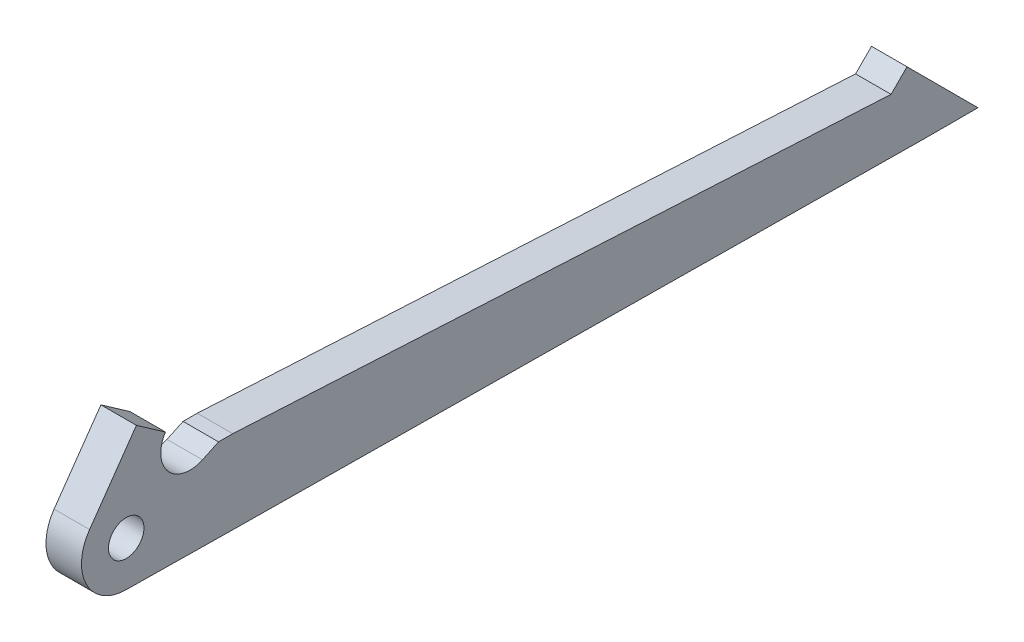
ISO-10303-21;
HEADER;
FILE_DESCRIPTION(('STEP AP214'),'2;1');
FILE_NAME('part.step','',(''),(''),'','','');
FILE_SCHEMA(('AUTOMOTIVE_DESIGN { 1 0 10303 214 1 1 1 1 }'));
ENDSEC;
DATA;
#1=APPLICATION_CONTEXT('core data for automotive mechanical design processes');
#2=APPLICATION_PROTOCOL_DEFINITION('international standard','automotive_design',2000,#1);
#3=PRODUCT_CONTEXT('',#1,'mechanical');
#4=PRODUCT('Part','Part','',(#3));
#5=PRODUCT_RELATED_PRODUCT_CATEGORY('part','',(#4));
#6=PRODUCT_DEFINITION_FORMATION('','',#4);
#7=PRODUCT_DEFINITION_CONTEXT('part definition',#1,'design');
#8=PRODUCT_DEFINITION('design','',#6,#7);
#9=PRODUCT_DEFINITION_SHAPE('','',#8);
#10=(LENGTH_UNIT() NAMED_UNIT(*) SI_UNIT(.MILLI.,.METRE.));
#11=(NAMED_UNIT(*) PLANE_ANGLE_UNIT() SI_UNIT($,.RADIAN.));
#12=(NAMED_UNIT(*) SI_UNIT($,.STERADIAN.) SOLID_ANGLE_UNIT());
#13=UNCERTAINTY_MEASURE_WITH_UNIT(LENGTH_MEASURE(1.E-05),#10,'distance_accuracy_value','');
#14=(GEOMETRIC_REPRESENTATION_CONTEXT(3) GLOBAL_UNCERTAINTY_ASSIGNED_CONTEXT((#13)) GLOBAL_UNIT_ASSIGNED_CONTEXT((#10,
#11,#12)) REPRESENTATION_CONTEXT('',''));
#15=CARTESIAN_POINT('',(0.,0.,0.));
#16=DIRECTION('',(0.,0.,1.));
#17=DIRECTION('',(1.,0.,0.));
#18=AXIS2_PLACEMENT_3D('',#15,#16,#17);
#19=CARTESIAN_POINT('',(6.35,9.525,-176.47164647412));
#20=DIRECTION('',(1.,0.,0.));
#21=DIRECTION('',(0.,0.,-1.));
#22=AXIS2_PLACEMENT_3D('',#19,#20,#21);
#23=PLANE('',#22);
#24=CARTESIAN_POINT('',(6.35,9.525,-176.47164647412));
#25=DIRECTION('',(1.,0.,0.));
#26=DIRECTION('',(0.,0.,-1.));
#27=AXIS2_PLACEMENT_3D('',#24,#25,#26);
#28=CIRCLE('',#27,8.00100000000001);
#29=CARTESIAN_POINT('',(6.35,14.1141850672447,-169.917610967764));
#30=VERTEX_POINT('',#29);
#31=CARTESIAN_POINT('',(6.35,1.52470715135464,-176.365272906379));
#32=VERTEX_POINT('',#31);
#33=EDGE_CURVE('E198',#30,#32,#28,.T.);
#34=ORIENTED_EDGE('',*,*,#33,.T.);
#35=DIRECTION('',(0.,-0.0132950340883751,-0.999911617128528));
#36=VECTOR('',#35,1.);
#37=CARTESIAN_POINT('',(6.35,1.27000000001228,-195.521646474134));
#38=LINE('',#37,#36);
#39=CARTESIAN_POINT('',(6.35,1.27000000001228,-195.521646474134));
#40=VERTEX_POINT('',#39);
#41=EDGE_CURVE('E200',#32,#40,#38,.T.);
#42=ORIENTED_EDGE('',*,*,#41,.T.);
#43=DIRECTION('',(0.,-0.0102558708428085,-0.999947407173625));
#44=VECTOR('',#43,1.);
#45=CARTESIAN_POINT('',(6.35,1.27000000001228,-195.521646474134));
#46=LINE('',#45,#44);
#47=CARTESIAN_POINT('',(6.35,1.22755538373154E-11,-319.346646474108));
#48=VERTEX_POINT('',#47);
#49=EDGE_CURVE('E187',#40,#48,#46,.T.);
#50=ORIENTED_EDGE('',*,*,#49,.T.);
#51=DIRECTION('',(0.,0.,-1.));
#52=VECTOR('',#51,1.);
#53=CARTESIAN_POINT('',(6.35,1.22755538373154E-11,-319.346646474108));
#54=LINE('',#53,#52);
#55=CARTESIAN_POINT('',(6.35,1.22755538373154E-11,-328.87164647412));
#56=VERTEX_POINT('',#55);
#57=EDGE_CURVE('E138',#48,#56,#54,.T.);
#58=ORIENTED_EDGE('',*,*,#57,.T.);
#59=DIRECTION('',(0.,0.70710678118655,0.707106781186545));
#60=VECTOR('',#59,1.);
#61=CARTESIAN_POINT('',(6.35,9.52500000002455,-319.346646474108));
#62=LINE('',#61,#60);
#63=CARTESIAN_POINT('',(6.35,12.7000000000245,-316.171646474108));
#64=VERTEX_POINT('',#63);
#65=EDGE_CURVE('E130',#56,#64,#62,.T.);
#66=ORIENTED_EDGE('',*,*,#65,.T.);
#67=DIRECTION('',(0.,-0.707106781186549,0.707106781186546));
#68=VECTOR('',#67,1.);
#69=CARTESIAN_POINT('',(6.35,12.7000000000245,-316.171646474108));
#70=LINE('',#69,#68);
#71=CARTESIAN_POINT('',(6.35,9.84818365484253,-313.319830128926));
#72=VERTEX_POINT('',#71);
#73=EDGE_CURVE('E134',#64,#72,#70,.T.);
#74=ORIENTED_EDGE('',*,*,#73,.T.);
#75=DIRECTION('',(0.,0.0535473405230793,0.998565311996619));
#76=VECTOR('',#75,1.);
#77=CARTESIAN_POINT('',(6.35,16.1650258056597,-195.52164647412));
#78=LINE('',#77,#76);
#79=CARTESIAN_POINT('',(6.35,16.1650258056597,-195.52164647412));
#80=VERTEX_POINT('',#79);
#81=EDGE_CURVE('E141',#72,#80,#78,.T.);
#82=ORIENTED_EDGE('',*,*,#81,.T.);
#83=DIRECTION('',(0.,0.,1.));
#84=VECTOR('',#83,1.);
#85=CARTESIAN_POINT('',(6.35,16.1650258056595,-192.993410989748));
#86=LINE('',#85,#84);
#87=CARTESIAN_POINT('',(6.35,16.1650258056595,-192.993410989748));
#88=VERTEX_POINT('',#87);
#89=EDGE_CURVE('E202',#80,#88,#86,.T.);
#90=ORIENTED_EDGE('',*,*,#89,.T.);
#91=DIRECTION('',(0.,-0.422618261740695,0.906307787036652));
#92=VECTOR('',#91,1.);
#93=CARTESIAN_POINT('',(6.35,14.8232128246327,-190.115883765906));
#94=LINE('',#93,#92);
#95=CARTESIAN_POINT('',(6.35,14.8232128246328,-190.115883765906));
#96=VERTEX_POINT('',#95);
#97=EDGE_CURVE('E204',#88,#96,#94,.T.);
#98=ORIENTED_EDGE('',*,*,#97,.T.);
#99=CARTESIAN_POINT('',(6.35,19.5790932010246,-187.898180325126));
#100=DIRECTION('',(-1.,0.,0.));
#101=DIRECTION('',(0.,0.,-1.));
#102=AXIS2_PLACEMENT_3D('',#99,#100,#101);
#103=CIRCLE('',#102,5.24753339253761);
#104=CARTESIAN_POINT('',(6.35,22.4356903032563,-183.496310301906));
#105=VERTEX_POINT('',#104);
#106=EDGE_CURVE('E206',#96,#105,#103,.T.);
#107=ORIENTED_EDGE('',*,*,#106,.T.);
#108=DIRECTION('',(0.,0.573576436351047,0.819152044288991));
#109=VECTOR('',#108,1.);
#110=CARTESIAN_POINT('',(6.35,26.0779006740854,-178.294694820671));
#111=LINE('',#110,#109);
#112=CARTESIAN_POINT('',(6.35,26.0779006740854,-178.294694820671));
#113=VERTEX_POINT('',#112);
#114=EDGE_CURVE('E208',#105,#113,#111,.T.);
#115=ORIENTED_EDGE('',*,*,#114,.T.);
#116=DIRECTION('',(0.,-0.819152044288991,0.573576436351048));
#117=VECTOR('',#116,1.);
#118=CARTESIAN_POINT('',(6.35,14.1141850672447,-169.917610967764));
#119=LINE('',#118,#117);
#120=EDGE_CURVE('E63',#113,#30,#119,.T.);
#121=ORIENTED_EDGE('',*,*,#120,.T.);
#122=EDGE_LOOP('',(#34,#42,#50,#58,#66,#74,#82,#90,#98,#107,#115,#121));
#123=FACE_BOUND('',#122,.T.);
#124=CARTESIAN_POINT('',(6.35,9.525,-176.47164647412));
#125=DIRECTION('',(1.,0.,0.));
#126=DIRECTION('',(0.,0.,-1.));
#127=AXIS2_PLACEMENT_3D('',#124,#125,#126);
#128=CIRCLE('',#127,3.17499999999995);
#129=CARTESIAN_POINT('',(6.35,9.525,-179.64664647412));
#130=VERTEX_POINT('',#129);
#131=EDGE_CURVE('E194',#130,#130,#128,.T.);
#132=ORIENTED_EDGE('',*,*,#131,.F.);
#133=EDGE_LOOP('',(#132));
#134=FACE_BOUND('',#133,.T.);
#135=ADVANCED_FACE('F41',(#123,#134),#23,.T.);
#136=CARTESIAN_POINT('',(6.35,9.525,-176.47164647412));
#137=DIRECTION('',(-1.,0.,0.));
#138=DIRECTION('',(0.,0.,1.));
#139=AXIS2_PLACEMENT_3D('',#136,#137,#138);
#140=CYLINDRICAL_SURFACE('',#139,8.00100000000001);
#141=DIRECTION('',(-1.,0.,0.));
#142=VECTOR('',#141,1.);
#143=CARTESIAN_POINT('',(6.35,14.1141850672447,-169.917610967764));
#144=LINE('',#143,#142);
#145=CARTESIAN_POINT('',(0.,14.1141850672447,-169.917610967764));
#146=VERTEX_POINT('',#145);
#147=EDGE_CURVE('E211',#30,#146,#144,.T.);
#148=ORIENTED_EDGE('',*,*,#147,.T.);
#149=CARTESIAN_POINT('',(0.,9.525,-176.47164647412));
#150=DIRECTION('',(1.,0.,0.));
#151=DIRECTION('',(0.,0.,-1.));
#152=AXIS2_PLACEMENT_3D('',#149,#150,#151);
#153=CIRCLE('',#152,8.00100000000001);
#154=CARTESIAN_POINT('',(0.,1.52470715135464,-176.365272906379));
#155=VERTEX_POINT('',#154);
#156=EDGE_CURVE('E169',#146,#155,#153,.T.);
#157=ORIENTED_EDGE('',*,*,#156,.T.);
#158=DIRECTION('',(-1.,0.,0.));
#159=VECTOR('',#158,1.);
#160=CARTESIAN_POINT('',(6.35,1.52470715135464,-176.365272906379));
#161=LINE('',#160,#159);
#162=EDGE_CURVE('E49',#32,#155,#161,.T.);
#163=ORIENTED_EDGE('',*,*,#162,.F.);
#164=ORIENTED_EDGE('',*,*,#33,.F.);
#165=EDGE_LOOP('',(#148,#157,#163,#164));
#166=FACE_BOUND('',#165,.T.);
#167=ADVANCED_FACE('F43',(#166),#140,.T.);
#168=CARTESIAN_POINT('',(6.35,1.27000000001228,-195.521646474134));
#169=DIRECTION('',(0.,0.999911617128528,-0.0132950340883751));
#170=DIRECTION('',(0.,0.0132950340883751,0.999911617128528));
#171=AXIS2_PLACEMENT_3D('',#168,#169,#170);
#172=PLANE('',#171);
#173=ORIENTED_EDGE('',*,*,#162,.T.);
#174=DIRECTION('',(0.,-0.0132950340883751,-0.999911617128528));
#175=VECTOR('',#174,1.);
#176=CARTESIAN_POINT('',(0.,1.27000000001228,-195.521646474134));
#177=LINE('',#176,#175);
#178=CARTESIAN_POINT('',(0.,1.27000000001228,-195.521646474134));
#179=VERTEX_POINT('',#178);
#180=EDGE_CURVE('E166',#155,#179,#177,.T.);
#181=ORIENTED_EDGE('',*,*,#180,.T.);
#182=DIRECTION('',(-1.,0.,0.));
#183=VECTOR('',#182,1.);
#184=CARTESIAN_POINT('',(6.35,1.27000000001228,-195.521646474134));
#185=LINE('',#184,#183);
#186=EDGE_CURVE('E229',#40,#179,#185,.T.);
#187=ORIENTED_EDGE('',*,*,#186,.F.);
#188=ORIENTED_EDGE('',*,*,#41,.F.);
#189=EDGE_LOOP('',(#173,#181,#187,#188));
#190=FACE_BOUND('',#189,.T.);
#191=ADVANCED_FACE('F234',(#190),#172,.F.);
#192=CARTESIAN_POINT('',(6.35,16.1650258056595,-192.993410989748));
#193=DIRECTION('',(0.,-1.,0.));
#194=DIRECTION('',(0.,0.,-1.));
#195=AXIS2_PLACEMENT_3D('',#192,#193,#194);
#196=PLANE('',#195);
#197=DIRECTION('',(-1.,0.,0.));
#198=VECTOR('',#197,1.);
#199=CARTESIAN_POINT('',(6.35,16.1650258056597,-195.52164647412));
#200=LINE('',#199,#198);
#201=CARTESIAN_POINT('',(0.,16.1650258056597,-195.52164647412));
#202=VERTEX_POINT('',#201);
#203=EDGE_CURVE('E226',#80,#202,#200,.T.);
#204=ORIENTED_EDGE('',*,*,#203,.T.);
#205=DIRECTION('',(0.,0.,1.));
#206=VECTOR('',#205,1.);
#207=CARTESIAN_POINT('',(0.,16.1650258056595,-192.993410989748));
#208=LINE('',#207,#206);
#209=CARTESIAN_POINT('',(0.,16.1650258056595,-192.993410989748));
#210=VERTEX_POINT('',#209);
#211=EDGE_CURVE('E163',#202,#210,#208,.T.);
#212=ORIENTED_EDGE('',*,*,#211,.T.);
#213=DIRECTION('',(-1.,0.,0.));
#214=VECTOR('',#213,1.);
#215=CARTESIAN_POINT('',(6.35,16.1650258056595,-192.993410989748));
#216=LINE('',#215,#214);
#217=EDGE_CURVE('E223',#88,#210,#216,.T.);
#218=ORIENTED_EDGE('',*,*,#217,.F.);
#219=ORIENTED_EDGE('',*,*,#89,.F.);
#220=EDGE_LOOP('',(#204,#212,#218,#219));
#221=FACE_BOUND('',#220,.T.);
#222=ADVANCED_FACE('F256',(#221),#196,.F.);
#223=CARTESIAN_POINT('',(6.35,14.8232128246327,-190.115883765906));
#224=DIRECTION('',(0.,-0.906307787036652,-0.422618261740695));
#225=DIRECTION('',(0.,0.422618261740695,-0.906307787036652));
#226=AXIS2_PLACEMENT_3D('',#223,#224,#225);
#227=PLANE('',#226);
#228=ORIENTED_EDGE('',*,*,#217,.T.);
#229=DIRECTION('',(0.,-0.422618261740695,0.906307787036652));
#230=VECTOR('',#229,1.);
#231=CARTESIAN_POINT('',(0.,14.8232128246327,-190.115883765906));
#232=LINE('',#231,#230);
#233=CARTESIAN_POINT('',(0.,14.8232128246328,-190.115883765906));
#234=VERTEX_POINT('',#233);
#235=EDGE_CURVE('E181',#210,#234,#232,.T.);
#236=ORIENTED_EDGE('',*,*,#235,.T.);
#237=DIRECTION('',(-1.,0.,0.));
#238=VECTOR('',#237,1.);
#239=CARTESIAN_POINT('',(6.35,14.8232128246328,-190.115883765906));
#240=LINE('',#239,#238);
#241=EDGE_CURVE('E220',#96,#234,#240,.T.);
#242=ORIENTED_EDGE('',*,*,#241,.F.);
#243=ORIENTED_EDGE('',*,*,#97,.F.);
#244=EDGE_LOOP('',(#228,#236,#242,#243));
#245=FACE_BOUND('',#244,.T.);
#246=ADVANCED_FACE('F252',(#245),#227,.F.);
#247=CARTESIAN_POINT('',(6.35,19.5790932010246,-187.898180325126));
#248=DIRECTION('',(-1.,0.,0.));
#249=DIRECTION('',(0.,0.,1.));
#250=AXIS2_PLACEMENT_3D('',#247,#248,#249);
#251=CYLINDRICAL_SURFACE('',#250,5.24753339253761);
#252=ORIENTED_EDGE('',*,*,#241,.T.);
#253=CARTESIAN_POINT('',(0.,19.5790932010246,-187.898180325126));
#254=DIRECTION('',(1.,0.,0.));
#255=DIRECTION('',(0.,0.,-1.));
#256=AXIS2_PLACEMENT_3D('',#253,#254,#255);
#257=CIRCLE('',#256,5.24753339253761);
#258=CARTESIAN_POINT('',(0.,22.4356903032563,-183.496310301906));
#259=VERTEX_POINT('',#258);
#260=EDGE_CURVE('E178',#234,#259,#257,.F.);
#261=ORIENTED_EDGE('',*,*,#260,.T.);
#262=DIRECTION('',(-1.,0.,0.));
#263=VECTOR('',#262,1.);
#264=CARTESIAN_POINT('',(6.35,22.4356903032563,-183.496310301906));
#265=LINE('',#264,#263);
#266=EDGE_CURVE('E217',#105,#259,#265,.T.);
#267=ORIENTED_EDGE('',*,*,#266,.F.);
#268=ORIENTED_EDGE('',*,*,#106,.F.);
#269=EDGE_LOOP('',(#252,#261,#267,#268));
#270=FACE_BOUND('',#269,.T.);
#271=ADVANCED_FACE('F247',(#270),#251,.F.);
#272=CARTESIAN_POINT('',(6.35,26.0779006740854,-178.294694820671));
#273=DIRECTION('',(0.,-0.819152044288991,0.573576436351047));
#274=DIRECTION('',(0.,-0.573576436351047,-0.819152044288991));
#275=AXIS2_PLACEMENT_3D('',#272,#273,#274);
#276=PLANE('',#275);
#277=ORIENTED_EDGE('',*,*,#266,.T.);
#278=DIRECTION('',(0.,0.573576436351047,0.819152044288991));
#279=VECTOR('',#278,1.);
#280=CARTESIAN_POINT('',(0.,26.0779006740854,-178.294694820671));
#281=LINE('',#280,#279);
#282=CARTESIAN_POINT('',(0.,26.0779006740854,-178.294694820671));
#283=VERTEX_POINT('',#282);
#284=EDGE_CURVE('E175',#259,#283,#281,.T.);
#285=ORIENTED_EDGE('',*,*,#284,.T.);
#286=DIRECTION('',(-1.,0.,0.));
#287=VECTOR('',#286,1.);
#288=CARTESIAN_POINT('',(6.35,26.0779006740854,-178.294694820671));
#289=LINE('',#288,#287);
#290=EDGE_CURVE('E214',#113,#283,#289,.T.);
#291=ORIENTED_EDGE('',*,*,#290,.F.);
#292=ORIENTED_EDGE('',*,*,#114,.F.);
#293=EDGE_LOOP('',(#277,#285,#291,#292));
#294=FACE_BOUND('',#293,.T.);
#295=ADVANCED_FACE('F244',(#294),#276,.F.);
#296=CARTESIAN_POINT('',(6.35,14.1141850672447,-169.917610967764));
#297=DIRECTION('',(0.,-0.573576436351048,-0.819152044288991));
#298=DIRECTION('',(0.,0.819152044288991,-0.573576436351048));
#299=AXIS2_PLACEMENT_3D('',#296,#297,#298);
#300=PLANE('',#299);
#301=ORIENTED_EDGE('',*,*,#290,.T.);
#302=DIRECTION('',(0.,-0.819152044288991,0.573576436351048));
#303=VECTOR('',#302,1.);
#304=CARTESIAN_POINT('',(0.,14.1141850672447,-169.917610967764));
#305=LINE('',#304,#303);
#306=EDGE_CURVE('E172',#283,#146,#305,.T.);
#307=ORIENTED_EDGE('',*,*,#306,.T.);
#308=ORIENTED_EDGE('',*,*,#147,.F.);
#309=ORIENTED_EDGE('',*,*,#120,.F.);
#310=EDGE_LOOP('',(#301,#307,#308,#309));
#311=FACE_BOUND('',#310,.T.);
#312=ADVANCED_FACE('F240',(#311),#300,.F.);
#313=CARTESIAN_POINT('',(6.35,9.525,-176.47164647412));
#314=DIRECTION('',(-1.,0.,0.));
#315=DIRECTION('',(0.,0.,1.));
#316=AXIS2_PLACEMENT_3D('',#313,#314,#315);
#317=CYLINDRICAL_SURFACE('',#316,3.17499999999995);
#318=CARTESIAN_POINT('',(0.,9.525,-176.47164647412));
#319=DIRECTION('',(1.,0.,0.));
#320=DIRECTION('',(0.,0.,-1.));
#321=AXIS2_PLACEMENT_3D('',#318,#319,#320);
#322=CIRCLE('',#321,3.17499999999995);
#323=CARTESIAN_POINT('',(0.,9.525,-179.64664647412));
#324=VERTEX_POINT('',#323);
#325=EDGE_CURVE('E184',#324,#324,#322,.T.);
#326=ORIENTED_EDGE('',*,*,#325,.F.);
#327=EDGE_LOOP('',(#326));
#328=FACE_BOUND('',#327,.T.);
#329=ORIENTED_EDGE('',*,*,#131,.T.);
#330=EDGE_LOOP('',(#329));
#331=FACE_BOUND('',#330,.T.);
#332=ADVANCED_FACE('F283',(#328,#331),#317,.F.);
#333=CARTESIAN_POINT('',(-140.676209502454,16.1650258056597,-195.52164647412));
#334=DIRECTION('',(0.,0.998565311996619,-0.0535473405230793));
#335=DIRECTION('',(0.,0.0535473405230793,0.998565311996619));
#336=AXIS2_PLACEMENT_3D('',#333,#334,#335);
#337=PLANE('',#336);
#338=DIRECTION('',(1.,0.,0.));
#339=VECTOR('',#338,1.);
#340=CARTESIAN_POINT('',(-6.81198504538538,9.84818365484253,-313.319830128926));
#341=LINE('',#340,#339);
#342=CARTESIAN_POINT('',(0.,9.84818365484256,-313.319830128926));
#343=VERTEX_POINT('',#342);
#344=EDGE_CURVE('E149',#343,#72,#341,.T.);
#345=ORIENTED_EDGE('',*,*,#344,.F.);
#346=DIRECTION('',(0.,-0.0535473405230793,-0.998565311996619));
#347=VECTOR('',#346,1.);
#348=CARTESIAN_POINT('',(0.,16.1650258056597,-195.52164647412));
#349=LINE('',#348,#347);
#350=EDGE_CURVE('E160',#202,#343,#349,.T.);
#351=ORIENTED_EDGE('',*,*,#350,.F.);
#352=ORIENTED_EDGE('',*,*,#203,.F.);
#353=ORIENTED_EDGE('',*,*,#81,.F.);
#354=EDGE_LOOP('',(#345,#351,#352,#353));
#355=FACE_BOUND('',#354,.T.);
#356=ADVANCED_FACE('F260',(#355),#337,.T.);
#357=CARTESIAN_POINT('',(-140.676209502454,9.52500000002455,-319.346646474108));
#358=DIRECTION('',(0.,0.707106781186546,-0.70710678118655));
#359=DIRECTION('',(0.,0.70710678118655,0.707106781186546));
#360=AXIS2_PLACEMENT_3D('',#357,#358,#359);
#361=PLANE('',#360);
#362=DIRECTION('',(0.,-0.70710678118655,-0.707106781186546));
#363=VECTOR('',#362,1.);
#364=CARTESIAN_POINT('',(0.,9.52500000002455,-319.346646474108));
#365=LINE('',#364,#363);
#366=CARTESIAN_POINT('',(0.,12.7000000000245,-316.171646474108));
#367=VERTEX_POINT('',#366);
#368=CARTESIAN_POINT('',(0.,1.22749033160119E-11,-328.87164647412));
#369=VERTEX_POINT('',#368);
#370=EDGE_CURVE('E146',#367,#369,#365,.T.);
#371=ORIENTED_EDGE('',*,*,#370,.F.);
#372=DIRECTION('',(1.,0.,0.));
#373=VECTOR('',#372,1.);
#374=CARTESIAN_POINT('',(-6.81198504538538,12.7000000000245,-316.171646474108));
#375=LINE('',#374,#373);
#376=EDGE_CURVE('E144',#367,#64,#375,.T.);
#377=ORIENTED_EDGE('',*,*,#376,.T.);
#378=ORIENTED_EDGE('',*,*,#65,.F.);
#379=DIRECTION('',(1.,0.,0.));
#380=VECTOR('',#379,1.);
#381=CARTESIAN_POINT('',(-140.676209502454,1.22755538373154E-11,-328.87164647412));
#382=LINE('',#381,#380);
#383=EDGE_CURVE('E192',#369,#56,#382,.T.);
#384=ORIENTED_EDGE('',*,*,#383,.F.);
#385=EDGE_LOOP('',(#371,#377,#378,#384));
#386=FACE_BOUND('',#385,.T.);
#387=ADVANCED_FACE('F145',(#386),#361,.T.);
#388=CARTESIAN_POINT('',(-140.676209502454,1.22755538373154E-11,-319.346646474108));
#389=DIRECTION('',(0.,-1.,0.));
#390=DIRECTION('',(0.,0.,-1.));
#391=AXIS2_PLACEMENT_3D('',#388,#389,#390);
#392=PLANE('',#391);
#393=DIRECTION('',(0.,0.,1.));
#394=VECTOR('',#393,1.);
#395=CARTESIAN_POINT('',(0.,1.22755538373154E-11,-319.346646474108));
#396=LINE('',#395,#394);
#397=CARTESIAN_POINT('',(0.,1.22755538373154E-11,-319.346646474108));
#398=VERTEX_POINT('',#397);
#399=EDGE_CURVE('E55',#369,#398,#396,.T.);
#400=ORIENTED_EDGE('',*,*,#399,.F.);
#401=ORIENTED_EDGE('',*,*,#383,.T.);
#402=ORIENTED_EDGE('',*,*,#57,.F.);
#403=DIRECTION('',(1.,0.,0.));
#404=VECTOR('',#403,1.);
#405=CARTESIAN_POINT('',(-140.676209502454,1.22755538373154E-11,-319.346646474108));
#406=LINE('',#405,#404);
#407=EDGE_CURVE('E191',#398,#48,#406,.T.);
#408=ORIENTED_EDGE('',*,*,#407,.F.);
#409=EDGE_LOOP('',(#400,#401,#402,#408));
#410=FACE_BOUND('',#409,.T.);
#411=ADVANCED_FACE('F263',(#410),#392,.T.);
#412=CARTESIAN_POINT('',(-140.676209502454,1.27000000001228,-195.521646474134));
#413=DIRECTION('',(0.,-0.999947407173625,0.0102558708428085));
#414=DIRECTION('',(0.,-0.0102558708428085,-0.999947407173625));
#415=AXIS2_PLACEMENT_3D('',#412,#413,#414);
#416=PLANE('',#415);
#417=DIRECTION('',(0.,0.0102558708428085,0.999947407173625));
#418=VECTOR('',#417,1.);
#419=CARTESIAN_POINT('',(0.,1.27000000001228,-195.521646474134));
#420=LINE('',#419,#418);
#421=EDGE_CURVE('E12',#398,#179,#420,.T.);
#422=ORIENTED_EDGE('',*,*,#421,.F.);
#423=ORIENTED_EDGE('',*,*,#407,.T.);
#424=ORIENTED_EDGE('',*,*,#49,.F.);
#425=ORIENTED_EDGE('',*,*,#186,.T.);
#426=EDGE_LOOP('',(#422,#423,#424,#425));
#427=FACE_BOUND('',#426,.T.);
#428=ADVANCED_FACE('F266',(#427),#416,.T.);
#429=CARTESIAN_POINT('',(0.,9.525,-176.47164647412));
#430=DIRECTION('',(1.,0.,0.));
#431=DIRECTION('',(0.,0.,-1.));
#432=AXIS2_PLACEMENT_3D('',#429,#430,#431);
#433=PLANE('',#432);
#434=ORIENTED_EDGE('',*,*,#325,.T.);
#435=EDGE_LOOP('',(#434));
#436=FACE_BOUND('',#435,.T.);
#437=ORIENTED_EDGE('',*,*,#211,.F.);
#438=ORIENTED_EDGE('',*,*,#350,.T.);
#439=DIRECTION('',(0.,0.707106781186549,-0.707106781186546));
#440=VECTOR('',#439,1.);
#441=CARTESIAN_POINT('',(0.,12.7000000000245,-316.171646474108));
#442=LINE('',#441,#440);
#443=EDGE_CURVE('E156',#343,#367,#442,.T.);
#444=ORIENTED_EDGE('',*,*,#443,.T.);
#445=ORIENTED_EDGE('',*,*,#370,.T.);
#446=ORIENTED_EDGE('',*,*,#399,.T.);
#447=ORIENTED_EDGE('',*,*,#421,.T.);
#448=ORIENTED_EDGE('',*,*,#180,.F.);
#449=ORIENTED_EDGE('',*,*,#156,.F.);
#450=ORIENTED_EDGE('',*,*,#306,.F.);
#451=ORIENTED_EDGE('',*,*,#284,.F.);
#452=ORIENTED_EDGE('',*,*,#260,.F.);
#453=ORIENTED_EDGE('',*,*,#235,.F.);
#454=EDGE_LOOP('',(#437,#438,#444,#445,#446,#447,#448,#449,#450,#451,#452,#453));
#455=FACE_BOUND('',#454,.T.);
#456=ADVANCED_FACE('F238',(#436,#455),#433,.F.);
#457=CARTESIAN_POINT('',(-6.81198504538538,12.7000000000245,-316.171646474108));
#458=DIRECTION('',(0.,0.707106781186546,0.707106781186549));
#459=DIRECTION('',(0.,-0.707106781186549,0.707106781186546));
#460=AXIS2_PLACEMENT_3D('',#457,#458,#459);
#461=PLANE('',#460);
#462=ORIENTED_EDGE('',*,*,#443,.F.);
#463=ORIENTED_EDGE('',*,*,#344,.T.);
#464=ORIENTED_EDGE('',*,*,#73,.F.);
#465=ORIENTED_EDGE('',*,*,#376,.F.);
#466=EDGE_LOOP('',(#462,#463,#464,#465));
#467=FACE_BOUND('',#466,.T.);
#468=ADVANCED_FACE('F151',(#467),#461,.T.);
#469=CLOSED_SHELL('',(#135,#167,#191,#222,#246,#271,#295,#312,#332,#356,#387,#411,#428,#456,#468));
#470=MANIFOLD_SOLID_BREP('B2',#469);
#471=ADVANCED_BREP_SHAPE_REPRESENTATION('',(#18,#470),#14);
#472=SHAPE_DEFINITION_REPRESENTATION(#9,#471);
ENDSEC;
END-ISO-10303-21;
